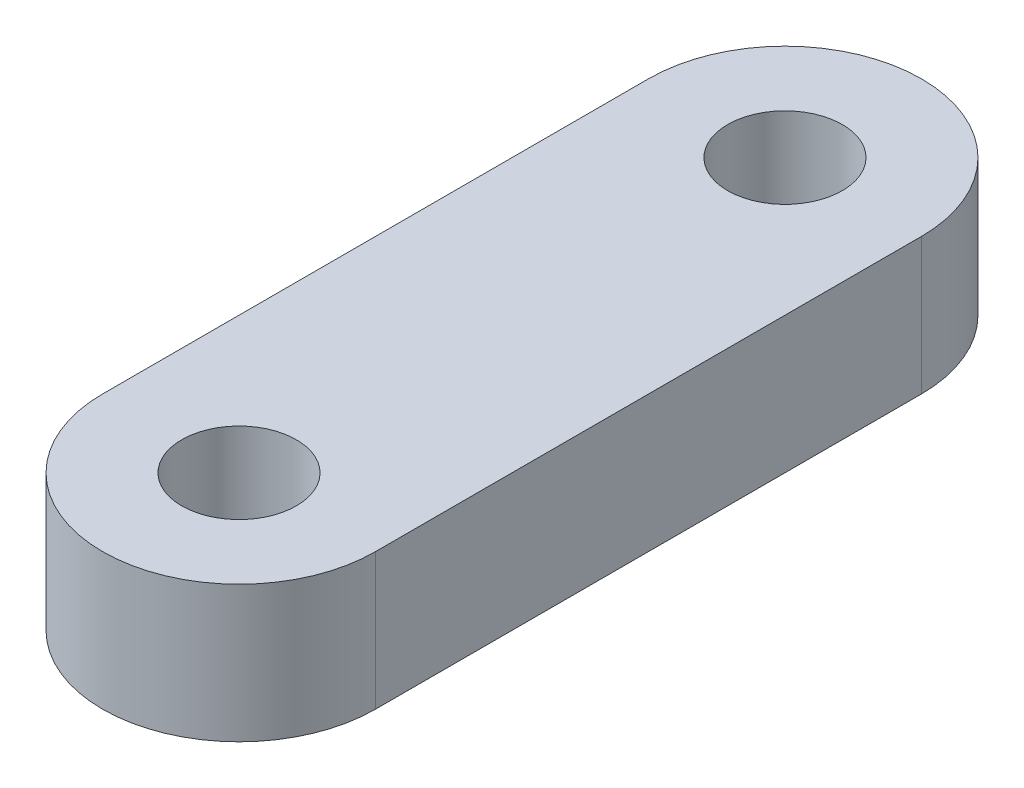
ISO-10303-21;
HEADER;
FILE_DESCRIPTION(('STEP AP214'),'2;1');
FILE_NAME('part.step','',(''),(''),'','','');
FILE_SCHEMA(('AUTOMOTIVE_DESIGN { 1 0 10303 214 1 1 1 1 }'));
ENDSEC;
DATA;
#1=APPLICATION_CONTEXT('core data for automotive mechanical design processes');
#2=APPLICATION_PROTOCOL_DEFINITION('international standard','automotive_design',2000,#1);
#3=PRODUCT_CONTEXT('',#1,'mechanical');
#4=PRODUCT('Part','Part','',(#3));
#5=PRODUCT_RELATED_PRODUCT_CATEGORY('part','',(#4));
#6=PRODUCT_DEFINITION_FORMATION('','',#4);
#7=PRODUCT_DEFINITION_CONTEXT('part definition',#1,'design');
#8=PRODUCT_DEFINITION('design','',#6,#7);
#9=PRODUCT_DEFINITION_SHAPE('','',#8);
#10=(LENGTH_UNIT() NAMED_UNIT(*) SI_UNIT(.MILLI.,.METRE.));
#11=(NAMED_UNIT(*) PLANE_ANGLE_UNIT() SI_UNIT($,.RADIAN.));
#12=(NAMED_UNIT(*) SI_UNIT($,.STERADIAN.) SOLID_ANGLE_UNIT());
#13=UNCERTAINTY_MEASURE_WITH_UNIT(LENGTH_MEASURE(1.E-05),#10,'distance_accuracy_value','');
#14=(GEOMETRIC_REPRESENTATION_CONTEXT(3) GLOBAL_UNCERTAINTY_ASSIGNED_CONTEXT((#13)) GLOBAL_UNIT_ASSIGNED_CONTEXT((#10,
#11,#12)) REPRESENTATION_CONTEXT('',''));
#15=CARTESIAN_POINT('',(0.,0.,0.));
#16=DIRECTION('',(0.,0.,1.));
#17=DIRECTION('',(1.,0.,0.));
#18=AXIS2_PLACEMENT_3D('',#15,#16,#17);
#19=CARTESIAN_POINT('',(0.,5.,10.));
#20=DIRECTION('',(0.,1.,0.));
#21=DIRECTION('',(0.,0.,1.));
#22=AXIS2_PLACEMENT_3D('',#19,#20,#21);
#23=PLANE('',#22);
#24=CARTESIAN_POINT('',(0.,5.,-10.));
#25=DIRECTION('',(0.,1.,0.));
#26=DIRECTION('',(0.,0.,1.));
#27=AXIS2_PLACEMENT_3D('',#24,#25,#26);
#28=CIRCLE('',#27,2.1);
#29=CARTESIAN_POINT('',(0.,5.,-7.9));
#30=VERTEX_POINT('',#29);
#31=EDGE_CURVE('E119',#30,#30,#28,.T.);
#32=ORIENTED_EDGE('',*,*,#31,.F.);
#33=EDGE_LOOP('',(#32));
#34=FACE_BOUND('',#33,.T.);
#35=CARTESIAN_POINT('',(0.,5.,10.));
#36=DIRECTION('',(0.,1.,0.));
#37=DIRECTION('',(0.,0.,1.));
#38=AXIS2_PLACEMENT_3D('',#35,#36,#37);
#39=CIRCLE('',#38,5.);
#40=CARTESIAN_POINT('',(-5.,5.,10.));
#41=VERTEX_POINT('',#40);
#42=CARTESIAN_POINT('',(5.,5.,10.));
#43=VERTEX_POINT('',#42);
#44=EDGE_CURVE('E91',#41,#43,#39,.T.);
#45=ORIENTED_EDGE('',*,*,#44,.T.);
#46=DIRECTION('',(0.,0.,-1.));
#47=VECTOR('',#46,1.);
#48=CARTESIAN_POINT('',(5.,5.,10.));
#49=LINE('',#48,#47);
#50=CARTESIAN_POINT('',(5.,5.,-10.));
#51=VERTEX_POINT('',#50);
#52=EDGE_CURVE('E86',#43,#51,#49,.T.);
#53=ORIENTED_EDGE('',*,*,#52,.T.);
#54=CARTESIAN_POINT('',(0.,5.,-10.));
#55=DIRECTION('',(0.,1.,0.));
#56=DIRECTION('',(0.,0.,1.));
#57=AXIS2_PLACEMENT_3D('',#54,#55,#56);
#58=CIRCLE('',#57,5.);
#59=CARTESIAN_POINT('',(-5.00000000000001,5.,-10.));
#60=VERTEX_POINT('',#59);
#61=EDGE_CURVE('E89',#51,#60,#58,.T.);
#62=ORIENTED_EDGE('',*,*,#61,.T.);
#63=DIRECTION('',(0.,0.,1.));
#64=VECTOR('',#63,1.);
#65=CARTESIAN_POINT('',(-5.,5.,10.));
#66=LINE('',#65,#64);
#67=EDGE_CURVE('E56',#60,#41,#66,.T.);
#68=ORIENTED_EDGE('',*,*,#67,.T.);
#69=EDGE_LOOP('',(#45,#53,#62,#68));
#70=FACE_BOUND('',#69,.T.);
#71=CARTESIAN_POINT('',(0.,5.,10.));
#72=DIRECTION('',(0.,1.,0.));
#73=DIRECTION('',(0.,0.,1.));
#74=AXIS2_PLACEMENT_3D('',#71,#72,#73);
#75=CIRCLE('',#74,2.1);
#76=CARTESIAN_POINT('',(0.,5.,12.1));
#77=VERTEX_POINT('',#76);
#78=EDGE_CURVE('E120',#77,#77,#75,.T.);
#79=ORIENTED_EDGE('',*,*,#78,.F.);
#80=EDGE_LOOP('',(#79));
#81=FACE_BOUND('',#80,.T.);
#82=ADVANCED_FACE('F39',(#34,#70,#81),#23,.T.);
#83=CARTESIAN_POINT('',(0.,0.,10.));
#84=DIRECTION('',(0.,1.,0.));
#85=DIRECTION('',(0.,0.,1.));
#86=AXIS2_PLACEMENT_3D('',#83,#84,#85);
#87=PLANE('',#86);
#88=CARTESIAN_POINT('',(0.,0.,10.));
#89=DIRECTION('',(0.,1.,0.));
#90=DIRECTION('',(0.,0.,1.));
#91=AXIS2_PLACEMENT_3D('',#88,#89,#90);
#92=CIRCLE('',#91,5.);
#93=CARTESIAN_POINT('',(-5.,0.,10.));
#94=VERTEX_POINT('',#93);
#95=CARTESIAN_POINT('',(5.,0.,10.));
#96=VERTEX_POINT('',#95);
#97=EDGE_CURVE('E125',#94,#96,#92,.T.);
#98=ORIENTED_EDGE('',*,*,#97,.F.);
#99=DIRECTION('',(0.,0.,1.));
#100=VECTOR('',#99,1.);
#101=CARTESIAN_POINT('',(-5.,0.,10.));
#102=LINE('',#101,#100);
#103=CARTESIAN_POINT('',(-5.00000000000001,0.,-10.));
#104=VERTEX_POINT('',#103);
#105=EDGE_CURVE('E79',#104,#94,#102,.T.);
#106=ORIENTED_EDGE('',*,*,#105,.F.);
#107=CARTESIAN_POINT('',(0.,0.,-10.));
#108=DIRECTION('',(0.,1.,0.));
#109=DIRECTION('',(0.,0.,1.));
#110=AXIS2_PLACEMENT_3D('',#107,#108,#109);
#111=CIRCLE('',#110,5.);
#112=CARTESIAN_POINT('',(5.,0.,-10.));
#113=VERTEX_POINT('',#112);
#114=EDGE_CURVE('E73',#113,#104,#111,.T.);
#115=ORIENTED_EDGE('',*,*,#114,.F.);
#116=DIRECTION('',(0.,0.,-1.));
#117=VECTOR('',#116,1.);
#118=CARTESIAN_POINT('',(5.,0.,10.));
#119=LINE('',#118,#117);
#120=EDGE_CURVE('E96',#96,#113,#119,.T.);
#121=ORIENTED_EDGE('',*,*,#120,.F.);
#122=EDGE_LOOP('',(#98,#106,#115,#121));
#123=FACE_BOUND('',#122,.T.);
#124=CARTESIAN_POINT('',(0.,0.,-10.));
#125=DIRECTION('',(0.,1.,0.));
#126=DIRECTION('',(0.,0.,1.));
#127=AXIS2_PLACEMENT_3D('',#124,#125,#126);
#128=CIRCLE('',#127,2.1);
#129=CARTESIAN_POINT('',(0.,0.,-7.9));
#130=VERTEX_POINT('',#129);
#131=EDGE_CURVE('E117',#130,#130,#128,.T.);
#132=ORIENTED_EDGE('',*,*,#131,.T.);
#133=EDGE_LOOP('',(#132));
#134=FACE_BOUND('',#133,.T.);
#135=CARTESIAN_POINT('',(0.,0.,10.));
#136=DIRECTION('',(0.,1.,0.));
#137=DIRECTION('',(0.,0.,1.));
#138=AXIS2_PLACEMENT_3D('',#135,#136,#137);
#139=CIRCLE('',#138,2.1);
#140=CARTESIAN_POINT('',(0.,0.,12.1));
#141=VERTEX_POINT('',#140);
#142=EDGE_CURVE('E126',#141,#141,#139,.T.);
#143=ORIENTED_EDGE('',*,*,#142,.T.);
#144=EDGE_LOOP('',(#143));
#145=FACE_BOUND('',#144,.T.);
#146=ADVANCED_FACE('F136',(#123,#134,#145),#87,.F.);
#147=CARTESIAN_POINT('',(0.,5.,10.));
#148=DIRECTION('',(0.,-1.,0.));
#149=DIRECTION('',(0.,0.,-1.));
#150=AXIS2_PLACEMENT_3D('',#147,#148,#149);
#151=CYLINDRICAL_SURFACE('',#150,5.);
#152=ORIENTED_EDGE('',*,*,#97,.T.);
#153=DIRECTION('',(0.,-1.,0.));
#154=VECTOR('',#153,1.);
#155=CARTESIAN_POINT('',(5.,5.,10.));
#156=LINE('',#155,#154);
#157=EDGE_CURVE('E12',#43,#96,#156,.T.);
#158=ORIENTED_EDGE('',*,*,#157,.F.);
#159=ORIENTED_EDGE('',*,*,#44,.F.);
#160=DIRECTION('',(0.,-1.,0.));
#161=VECTOR('',#160,1.);
#162=CARTESIAN_POINT('',(-5.,5.,10.));
#163=LINE('',#162,#161);
#164=EDGE_CURVE('E102',#41,#94,#163,.T.);
#165=ORIENTED_EDGE('',*,*,#164,.T.);
#166=EDGE_LOOP('',(#152,#158,#159,#165));
#167=FACE_BOUND('',#166,.T.);
#168=ADVANCED_FACE('F41',(#167),#151,.T.);
#169=CARTESIAN_POINT('',(5.,5.,10.));
#170=DIRECTION('',(-1.,0.,0.));
#171=DIRECTION('',(0.,0.,1.));
#172=AXIS2_PLACEMENT_3D('',#169,#170,#171);
#173=PLANE('',#172);
#174=ORIENTED_EDGE('',*,*,#120,.T.);
#175=DIRECTION('',(0.,-1.,0.));
#176=VECTOR('',#175,1.);
#177=CARTESIAN_POINT('',(5.,5.,-10.));
#178=LINE('',#177,#176);
#179=EDGE_CURVE('E48',#51,#113,#178,.T.);
#180=ORIENTED_EDGE('',*,*,#179,.F.);
#181=ORIENTED_EDGE('',*,*,#52,.F.);
#182=ORIENTED_EDGE('',*,*,#157,.T.);
#183=EDGE_LOOP('',(#174,#180,#181,#182));
#184=FACE_BOUND('',#183,.T.);
#185=ADVANCED_FACE('F95',(#184),#173,.F.);
#186=CARTESIAN_POINT('',(0.,5.,-10.));
#187=DIRECTION('',(0.,-1.,0.));
#188=DIRECTION('',(0.,0.,-1.));
#189=AXIS2_PLACEMENT_3D('',#186,#187,#188);
#190=CYLINDRICAL_SURFACE('',#189,5.);
#191=ORIENTED_EDGE('',*,*,#114,.T.);
#192=DIRECTION('',(0.,-1.,0.));
#193=VECTOR('',#192,1.);
#194=CARTESIAN_POINT('',(-5.00000000000001,5.,-10.));
#195=LINE('',#194,#193);
#196=EDGE_CURVE('E97',#60,#104,#195,.T.);
#197=ORIENTED_EDGE('',*,*,#196,.F.);
#198=ORIENTED_EDGE('',*,*,#61,.F.);
#199=ORIENTED_EDGE('',*,*,#179,.T.);
#200=EDGE_LOOP('',(#191,#197,#198,#199));
#201=FACE_BOUND('',#200,.T.);
#202=ADVANCED_FACE('F98',(#201),#190,.T.);
#203=CARTESIAN_POINT('',(-5.,5.,10.));
#204=DIRECTION('',(1.,0.,0.));
#205=DIRECTION('',(0.,0.,-1.));
#206=AXIS2_PLACEMENT_3D('',#203,#204,#205);
#207=PLANE('',#206);
#208=ORIENTED_EDGE('',*,*,#105,.T.);
#209=ORIENTED_EDGE('',*,*,#164,.F.);
#210=ORIENTED_EDGE('',*,*,#67,.F.);
#211=ORIENTED_EDGE('',*,*,#196,.T.);
#212=EDGE_LOOP('',(#208,#209,#210,#211));
#213=FACE_BOUND('',#212,.T.);
#214=ADVANCED_FACE('F149',(#213),#207,.F.);
#215=CARTESIAN_POINT('',(0.,5.,-10.));
#216=DIRECTION('',(0.,-1.,0.));
#217=DIRECTION('',(0.,0.,-1.));
#218=AXIS2_PLACEMENT_3D('',#215,#216,#217);
#219=CYLINDRICAL_SURFACE('',#218,2.1);
#220=ORIENTED_EDGE('',*,*,#31,.T.);
#221=EDGE_LOOP('',(#220));
#222=FACE_BOUND('',#221,.T.);
#223=ORIENTED_EDGE('',*,*,#131,.F.);
#224=EDGE_LOOP('',(#223));
#225=FACE_BOUND('',#224,.T.);
#226=ADVANCED_FACE('F146',(#222,#225),#219,.F.);
#227=CARTESIAN_POINT('',(0.,5.,10.));
#228=DIRECTION('',(0.,-1.,0.));
#229=DIRECTION('',(0.,0.,-1.));
#230=AXIS2_PLACEMENT_3D('',#227,#228,#229);
#231=CYLINDRICAL_SURFACE('',#230,2.1);
#232=ORIENTED_EDGE('',*,*,#78,.T.);
#233=EDGE_LOOP('',(#232));
#234=FACE_BOUND('',#233,.T.);
#235=ORIENTED_EDGE('',*,*,#142,.F.);
#236=EDGE_LOOP('',(#235));
#237=FACE_BOUND('',#236,.T.);
#238=ADVANCED_FACE('F133',(#234,#237),#231,.F.);
#239=CLOSED_SHELL('',(#82,#146,#168,#185,#202,#214,#226,#238));
#240=MANIFOLD_SOLID_BREP('B2',#239);
#241=ADVANCED_BREP_SHAPE_REPRESENTATION('',(#18,#240),#14);
#242=SHAPE_DEFINITION_REPRESENTATION(#9,#241);
ENDSEC;
END-ISO-10303-21;
